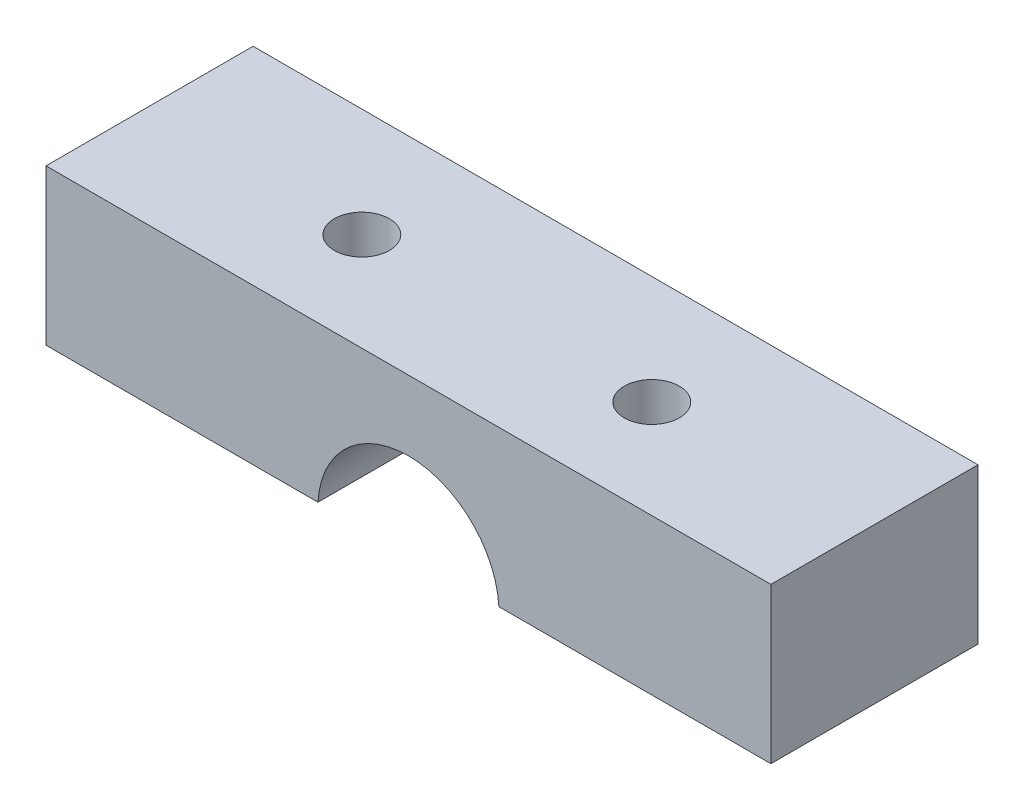
ISO-10303-21;
HEADER;
FILE_DESCRIPTION(('STEP AP214'),'2;1');
FILE_NAME('part.step','',(''),(''),'','','');
FILE_SCHEMA(('AUTOMOTIVE_DESIGN { 1 0 10303 214 1 1 1 1 }'));
ENDSEC;
DATA;
#1=APPLICATION_CONTEXT('core data for automotive mechanical design processes');
#2=APPLICATION_PROTOCOL_DEFINITION('international standard','automotive_design',2000,#1);
#3=PRODUCT_CONTEXT('',#1,'mechanical');
#4=PRODUCT('Part','Part','',(#3));
#5=PRODUCT_RELATED_PRODUCT_CATEGORY('part','',(#4));
#6=PRODUCT_DEFINITION_FORMATION('','',#4);
#7=PRODUCT_DEFINITION_CONTEXT('part definition',#1,'design');
#8=PRODUCT_DEFINITION('design','',#6,#7);
#9=PRODUCT_DEFINITION_SHAPE('','',#8);
#10=(LENGTH_UNIT() NAMED_UNIT(*) SI_UNIT(.MILLI.,.METRE.));
#11=(NAMED_UNIT(*) PLANE_ANGLE_UNIT() SI_UNIT($,.RADIAN.));
#12=(NAMED_UNIT(*) SI_UNIT($,.STERADIAN.) SOLID_ANGLE_UNIT());
#13=UNCERTAINTY_MEASURE_WITH_UNIT(LENGTH_MEASURE(1.E-05),#10,'distance_accuracy_value','');
#14=(GEOMETRIC_REPRESENTATION_CONTEXT(3) GLOBAL_UNCERTAINTY_ASSIGNED_CONTEXT((#13)) GLOBAL_UNIT_ASSIGNED_CONTEXT((#10,
#11,#12)) REPRESENTATION_CONTEXT('',''));
#15=CARTESIAN_POINT('',(0.,0.,0.));
#16=DIRECTION('',(0.,0.,1.));
#17=DIRECTION('',(1.,0.,0.));
#18=AXIS2_PLACEMENT_3D('',#15,#16,#17);
#19=CARTESIAN_POINT('',(0.,19.685,9.525));
#20=DIRECTION('',(0.,1.,0.));
#21=DIRECTION('',(-1.,0.,0.));
#22=AXIS2_PLACEMENT_3D('',#19,#20,#21);
#23=PLANE('',#22);
#24=DIRECTION('',(-1.,0.,0.));
#25=VECTOR('',#24,1.);
#26=CARTESIAN_POINT('',(0.,19.685,34.925));
#27=LINE('',#26,#25);
#28=CARTESIAN_POINT('',(44.45,19.685,34.925));
#29=VERTEX_POINT('',#28);
#30=CARTESIAN_POINT('',(-44.45,19.685,34.925));
#31=VERTEX_POINT('',#30);
#32=EDGE_CURVE('E140',#29,#31,#27,.T.);
#33=ORIENTED_EDGE('',*,*,#32,.F.);
#34=DIRECTION('',(0.,0.,1.));
#35=VECTOR('',#34,1.);
#36=CARTESIAN_POINT('',(44.45,19.685,9.525));
#37=LINE('',#36,#35);
#38=CARTESIAN_POINT('',(44.45,19.685,9.525));
#39=VERTEX_POINT('',#38);
#40=EDGE_CURVE('E58',#39,#29,#37,.T.);
#41=ORIENTED_EDGE('',*,*,#40,.F.);
#42=DIRECTION('',(-1.,0.,0.));
#43=VECTOR('',#42,1.);
#44=CARTESIAN_POINT('',(0.,19.685,9.525));
#45=LINE('',#44,#43);
#46=CARTESIAN_POINT('',(-44.45,19.685,9.525));
#47=VERTEX_POINT('',#46);
#48=EDGE_CURVE('E184',#39,#47,#45,.T.);
#49=ORIENTED_EDGE('',*,*,#48,.T.);
#50=DIRECTION('',(0.,0.,1.));
#51=VECTOR('',#50,1.);
#52=CARTESIAN_POINT('',(-44.45,19.685,9.525));
#53=LINE('',#52,#51);
#54=EDGE_CURVE('E11',#47,#31,#53,.T.);
#55=ORIENTED_EDGE('',*,*,#54,.T.);
#56=EDGE_LOOP('',(#33,#41,#49,#55));
#57=FACE_BOUND('',#56,.T.);
#58=CARTESIAN_POINT('',(17.78,19.685,22.86));
#59=DIRECTION('',(0.,1.,0.));
#60=DIRECTION('',(-1.,0.,0.));
#61=AXIS2_PLACEMENT_3D('',#58,#59,#60);
#62=CIRCLE('',#61,3.3782);
#63=CARTESIAN_POINT('',(14.4018,19.685,22.86));
#64=VERTEX_POINT('',#63);
#65=EDGE_CURVE('E141',#64,#64,#62,.T.);
#66=ORIENTED_EDGE('',*,*,#65,.F.);
#67=EDGE_LOOP('',(#66));
#68=FACE_BOUND('',#67,.T.);
#69=CARTESIAN_POINT('',(-17.78,19.685,22.86));
#70=DIRECTION('',(0.,1.,0.));
#71=DIRECTION('',(-1.,0.,0.));
#72=AXIS2_PLACEMENT_3D('',#69,#70,#71);
#73=CIRCLE('',#72,3.3782);
#74=CARTESIAN_POINT('',(-21.1582,19.685,22.86));
#75=VERTEX_POINT('',#74);
#76=EDGE_CURVE('E168',#75,#75,#73,.F.);
#77=ORIENTED_EDGE('',*,*,#76,.T.);
#78=EDGE_LOOP('',(#77));
#79=FACE_BOUND('',#78,.T.);
#80=ADVANCED_FACE('F47',(#57,#68,#79),#23,.T.);
#81=CARTESIAN_POINT('',(44.45,0.,9.525));
#82=DIRECTION('',(1.,0.,0.));
#83=DIRECTION('',(0.,0.,-1.));
#84=AXIS2_PLACEMENT_3D('',#81,#82,#83);
#85=PLANE('',#84);
#86=DIRECTION('',(0.,1.,0.));
#87=VECTOR('',#86,1.);
#88=CARTESIAN_POINT('',(44.45,0.,34.925));
#89=LINE('',#88,#87);
#90=CARTESIAN_POINT('',(44.45,0.634999999999989,34.925));
#91=VERTEX_POINT('',#90);
#92=EDGE_CURVE('E145',#91,#29,#89,.T.);
#93=ORIENTED_EDGE('',*,*,#92,.F.);
#94=DIRECTION('',(0.,0.,1.));
#95=VECTOR('',#94,1.);
#96=CARTESIAN_POINT('',(44.45,0.634999999999989,9.525));
#97=LINE('',#96,#95);
#98=CARTESIAN_POINT('',(44.45,0.634999999999989,9.525));
#99=VERTEX_POINT('',#98);
#100=EDGE_CURVE('E127',#99,#91,#97,.T.);
#101=ORIENTED_EDGE('',*,*,#100,.F.);
#102=DIRECTION('',(0.,1.,0.));
#103=VECTOR('',#102,1.);
#104=CARTESIAN_POINT('',(44.45,0.,9.525));
#105=LINE('',#104,#103);
#106=EDGE_CURVE('E115',#99,#39,#105,.T.);
#107=ORIENTED_EDGE('',*,*,#106,.T.);
#108=ORIENTED_EDGE('',*,*,#40,.T.);
#109=EDGE_LOOP('',(#93,#101,#107,#108));
#110=FACE_BOUND('',#109,.T.);
#111=ADVANCED_FACE('F190',(#110),#85,.T.);
#112=CARTESIAN_POINT('',(0.,0.635000000000019,9.525));
#113=DIRECTION('',(0.,1.,0.));
#114=DIRECTION('',(-1.,0.,0.));
#115=AXIS2_PLACEMENT_3D('',#112,#113,#114);
#116=PLANE('',#115);
#117=CARTESIAN_POINT('',(17.78,0.635000000000004,22.86));
#118=DIRECTION('',(0.,1.,0.));
#119=DIRECTION('',(-1.,0.,0.));
#120=AXIS2_PLACEMENT_3D('',#117,#118,#119);
#121=CIRCLE('',#120,3.3782);
#122=CARTESIAN_POINT('',(14.4018,0.635000000000006,22.86));
#123=VERTEX_POINT('',#122);
#124=EDGE_CURVE('E51',#123,#123,#121,.T.);
#125=ORIENTED_EDGE('',*,*,#124,.T.);
#126=EDGE_LOOP('',(#125));
#127=FACE_BOUND('',#126,.T.);
#128=DIRECTION('',(-1.,0.,0.));
#129=VECTOR('',#128,1.);
#130=CARTESIAN_POINT('',(0.,0.635000000000019,34.925));
#131=LINE('',#130,#129);
#132=CARTESIAN_POINT('',(11.0943423081317,0.635000000000011,34.925));
#133=VERTEX_POINT('',#132);
#134=EDGE_CURVE('E123',#91,#133,#131,.T.);
#135=ORIENTED_EDGE('',*,*,#134,.T.);
#136=DIRECTION('',(0.,0.,1.));
#137=VECTOR('',#136,1.);
#138=CARTESIAN_POINT('',(11.0943423081317,0.635000000000011,9.525));
#139=LINE('',#138,#137);
#140=CARTESIAN_POINT('',(11.0943423081317,0.635000000000011,9.525));
#141=VERTEX_POINT('',#140);
#142=EDGE_CURVE('E120',#141,#133,#139,.T.);
#143=ORIENTED_EDGE('',*,*,#142,.F.);
#144=DIRECTION('',(-1.,0.,0.));
#145=VECTOR('',#144,1.);
#146=CARTESIAN_POINT('',(0.,0.635000000000019,9.525));
#147=LINE('',#146,#145);
#148=EDGE_CURVE('E109',#99,#141,#147,.T.);
#149=ORIENTED_EDGE('',*,*,#148,.F.);
#150=ORIENTED_EDGE('',*,*,#100,.T.);
#151=EDGE_LOOP('',(#135,#143,#149,#150));
#152=FACE_BOUND('',#151,.T.);
#153=ADVANCED_FACE('F121',(#127,#152),#116,.F.);
#154=CARTESIAN_POINT('',(0.,0.,9.525));
#155=DIRECTION('',(0.,0.,1.));
#156=DIRECTION('',(1.,0.,0.));
#157=AXIS2_PLACEMENT_3D('',#154,#155,#156);
#158=CYLINDRICAL_SURFACE('',#157,11.1125);
#159=CARTESIAN_POINT('',(0.,0.,34.925));
#160=DIRECTION('',(0.,0.,1.));
#161=DIRECTION('',(1.,0.,0.));
#162=AXIS2_PLACEMENT_3D('',#159,#160,#161);
#163=CIRCLE('',#162,11.1125);
#164=CARTESIAN_POINT('',(-11.0943423081317,0.635000000000006,34.925));
#165=VERTEX_POINT('',#164);
#166=EDGE_CURVE('E151',#133,#165,#163,.T.);
#167=ORIENTED_EDGE('',*,*,#166,.T.);
#168=DIRECTION('',(0.,0.,1.));
#169=VECTOR('',#168,1.);
#170=CARTESIAN_POINT('',(-11.0943423081317,0.635000000000006,9.525));
#171=LINE('',#170,#169);
#172=CARTESIAN_POINT('',(-11.0943423081317,0.635000000000006,9.525));
#173=VERTEX_POINT('',#172);
#174=EDGE_CURVE('E87',#173,#165,#171,.T.);
#175=ORIENTED_EDGE('',*,*,#174,.F.);
#176=CARTESIAN_POINT('',(0.,0.,9.525));
#177=DIRECTION('',(0.,0.,1.));
#178=DIRECTION('',(1.,0.,0.));
#179=AXIS2_PLACEMENT_3D('',#176,#177,#178);
#180=CIRCLE('',#179,11.1125);
#181=EDGE_CURVE('E113',#141,#173,#180,.T.);
#182=ORIENTED_EDGE('',*,*,#181,.F.);
#183=ORIENTED_EDGE('',*,*,#142,.T.);
#184=EDGE_LOOP('',(#167,#175,#182,#183));
#185=FACE_BOUND('',#184,.T.);
#186=ADVANCED_FACE('F129',(#185),#158,.F.);
#187=CARTESIAN_POINT('',(0.,0.635000000000008,9.525));
#188=DIRECTION('',(0.,-1.,0.));
#189=DIRECTION('',(1.,0.,0.));
#190=AXIS2_PLACEMENT_3D('',#187,#188,#189);
#191=PLANE('',#190);
#192=CARTESIAN_POINT('',(-17.78,0.635000000000011,22.86));
#193=DIRECTION('',(0.,-1.,0.));
#194=DIRECTION('',(1.,0.,0.));
#195=AXIS2_PLACEMENT_3D('',#192,#193,#194);
#196=CIRCLE('',#195,3.3782);
#197=CARTESIAN_POINT('',(-14.4018,0.635000000000011,22.86));
#198=VERTEX_POINT('',#197);
#199=EDGE_CURVE('E165',#198,#198,#196,.F.);
#200=ORIENTED_EDGE('',*,*,#199,.T.);
#201=EDGE_LOOP('',(#200));
#202=FACE_BOUND('',#201,.T.);
#203=DIRECTION('',(1.,0.,0.));
#204=VECTOR('',#203,1.);
#205=CARTESIAN_POINT('',(0.,0.635000000000008,34.925));
#206=LINE('',#205,#204);
#207=CARTESIAN_POINT('',(-44.45,0.635,34.925));
#208=VERTEX_POINT('',#207);
#209=EDGE_CURVE('E154',#208,#165,#206,.T.);
#210=ORIENTED_EDGE('',*,*,#209,.F.);
#211=DIRECTION('',(0.,0.,1.));
#212=VECTOR('',#211,1.);
#213=CARTESIAN_POINT('',(-44.45,0.635,9.525));
#214=LINE('',#213,#212);
#215=CARTESIAN_POINT('',(-44.45,0.635,9.525));
#216=VERTEX_POINT('',#215);
#217=EDGE_CURVE('E67',#216,#208,#214,.T.);
#218=ORIENTED_EDGE('',*,*,#217,.F.);
#219=DIRECTION('',(1.,0.,0.));
#220=VECTOR('',#219,1.);
#221=CARTESIAN_POINT('',(0.,0.635000000000008,9.525));
#222=LINE('',#221,#220);
#223=EDGE_CURVE('E131',#216,#173,#222,.T.);
#224=ORIENTED_EDGE('',*,*,#223,.T.);
#225=ORIENTED_EDGE('',*,*,#174,.T.);
#226=EDGE_LOOP('',(#210,#218,#224,#225));
#227=FACE_BOUND('',#226,.T.);
#228=ADVANCED_FACE('F194',(#202,#227),#191,.T.);
#229=CARTESIAN_POINT('',(0.,0.,9.525));
#230=DIRECTION('',(0.,0.,1.));
#231=DIRECTION('',(1.,0.,0.));
#232=AXIS2_PLACEMENT_3D('',#229,#230,#231);
#233=PLANE('',#232);
#234=DIRECTION('',(0.,1.,0.));
#235=VECTOR('',#234,1.);
#236=CARTESIAN_POINT('',(-44.45,0.,9.525));
#237=LINE('',#236,#235);
#238=EDGE_CURVE('E99',#216,#47,#237,.T.);
#239=ORIENTED_EDGE('',*,*,#238,.T.);
#240=ORIENTED_EDGE('',*,*,#48,.F.);
#241=ORIENTED_EDGE('',*,*,#106,.F.);
#242=ORIENTED_EDGE('',*,*,#148,.T.);
#243=ORIENTED_EDGE('',*,*,#181,.T.);
#244=ORIENTED_EDGE('',*,*,#223,.F.);
#245=EDGE_LOOP('',(#239,#240,#241,#242,#243,#244));
#246=FACE_BOUND('',#245,.T.);
#247=ADVANCED_FACE('F111',(#246),#233,.F.);
#248=CARTESIAN_POINT('',(0.,0.,34.925));
#249=DIRECTION('',(0.,0.,1.));
#250=DIRECTION('',(1.,0.,0.));
#251=AXIS2_PLACEMENT_3D('',#248,#249,#250);
#252=PLANE('',#251);
#253=DIRECTION('',(0.,1.,0.));
#254=VECTOR('',#253,1.);
#255=CARTESIAN_POINT('',(-44.45,0.,34.925));
#256=LINE('',#255,#254);
#257=EDGE_CURVE('E137',#208,#31,#256,.T.);
#258=ORIENTED_EDGE('',*,*,#257,.F.);
#259=ORIENTED_EDGE('',*,*,#209,.T.);
#260=ORIENTED_EDGE('',*,*,#166,.F.);
#261=ORIENTED_EDGE('',*,*,#134,.F.);
#262=ORIENTED_EDGE('',*,*,#92,.T.);
#263=ORIENTED_EDGE('',*,*,#32,.T.);
#264=EDGE_LOOP('',(#258,#259,#260,#261,#262,#263));
#265=FACE_BOUND('',#264,.T.);
#266=ADVANCED_FACE('F193',(#265),#252,.T.);
#267=CARTESIAN_POINT('',(-17.78,-44.45,22.86));
#268=DIRECTION('',(0.,1.,0.));
#269=DIRECTION('',(0.,0.,1.));
#270=AXIS2_PLACEMENT_3D('',#267,#268,#269);
#271=CYLINDRICAL_SURFACE('',#270,3.3782);
#272=ORIENTED_EDGE('',*,*,#76,.F.);
#273=EDGE_LOOP('',(#272));
#274=FACE_BOUND('',#273,.T.);
#275=ORIENTED_EDGE('',*,*,#199,.F.);
#276=EDGE_LOOP('',(#275));
#277=FACE_BOUND('',#276,.T.);
#278=ADVANCED_FACE('F211',(#274,#277),#271,.F.);
#279=CARTESIAN_POINT('',(17.78,-44.45,22.86));
#280=DIRECTION('',(0.,1.,0.));
#281=DIRECTION('',(0.,0.,1.));
#282=AXIS2_PLACEMENT_3D('',#279,#280,#281);
#283=CYLINDRICAL_SURFACE('',#282,3.3782);
#284=ORIENTED_EDGE('',*,*,#65,.T.);
#285=EDGE_LOOP('',(#284));
#286=FACE_BOUND('',#285,.T.);
#287=ORIENTED_EDGE('',*,*,#124,.F.);
#288=EDGE_LOOP('',(#287));
#289=FACE_BOUND('',#288,.T.);
#290=ADVANCED_FACE('F206',(#286,#289),#283,.F.);
#291=CARTESIAN_POINT('',(-44.45,0.,9.525));
#292=DIRECTION('',(1.,0.,0.));
#293=DIRECTION('',(0.,0.,-1.));
#294=AXIS2_PLACEMENT_3D('',#291,#292,#293);
#295=PLANE('',#294);
#296=ORIENTED_EDGE('',*,*,#257,.T.);
#297=ORIENTED_EDGE('',*,*,#54,.F.);
#298=ORIENTED_EDGE('',*,*,#238,.F.);
#299=ORIENTED_EDGE('',*,*,#217,.T.);
#300=EDGE_LOOP('',(#296,#297,#298,#299));
#301=FACE_BOUND('',#300,.T.);
#302=ADVANCED_FACE('F49',(#301),#295,.F.);
#303=CLOSED_SHELL('',(#80,#111,#153,#186,#228,#247,#266,#278,#290,#302));
#304=MANIFOLD_SOLID_BREP('B2',#303);
#305=ADVANCED_BREP_SHAPE_REPRESENTATION('',(#18,#304),#14);
#306=SHAPE_DEFINITION_REPRESENTATION(#9,#305);
ENDSEC;
END-ISO-10303-21;
